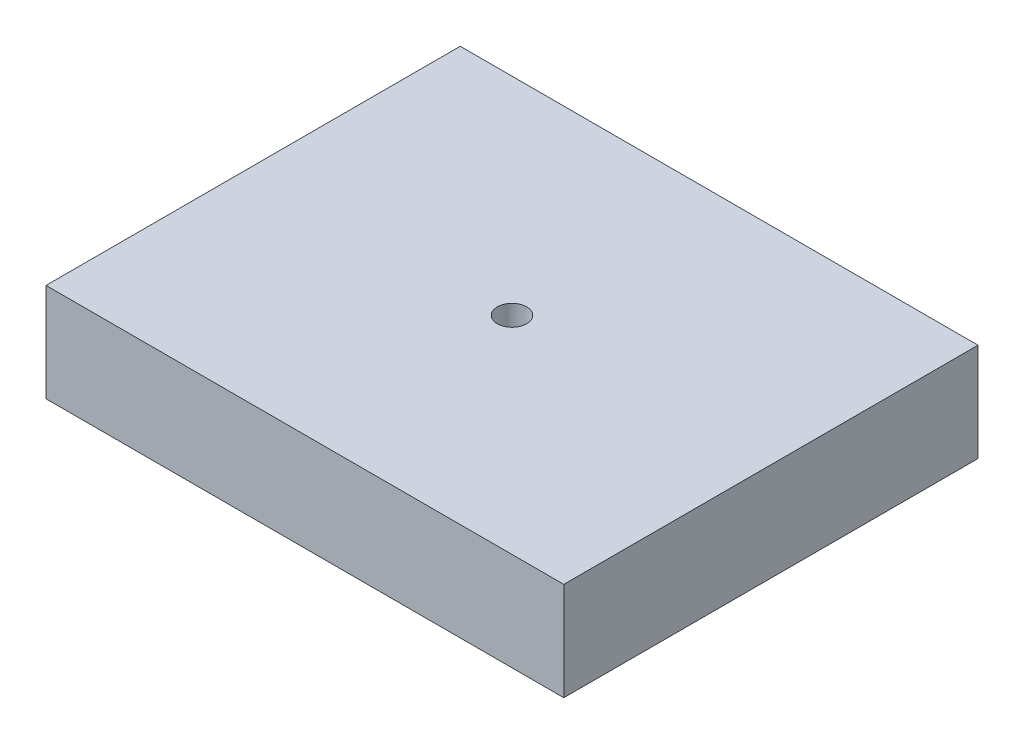
ISO-10303-21;
HEADER;
FILE_DESCRIPTION(('STEP AP214'),'2;1');
FILE_NAME('part.step','',(''),(''),'','','');
FILE_SCHEMA(('AUTOMOTIVE_DESIGN { 1 0 10303 214 1 1 1 1 }'));
ENDSEC;
DATA;
#1=APPLICATION_CONTEXT('core data for automotive mechanical design processes');
#2=APPLICATION_PROTOCOL_DEFINITION('international standard','automotive_design',2000,#1);
#3=PRODUCT_CONTEXT('',#1,'mechanical');
#4=PRODUCT('Part','Part','',(#3));
#5=PRODUCT_RELATED_PRODUCT_CATEGORY('part','',(#4));
#6=PRODUCT_DEFINITION_FORMATION('','',#4);
#7=PRODUCT_DEFINITION_CONTEXT('part definition',#1,'design');
#8=PRODUCT_DEFINITION('design','',#6,#7);
#9=PRODUCT_DEFINITION_SHAPE('','',#8);
#10=(LENGTH_UNIT() NAMED_UNIT(*) SI_UNIT(.MILLI.,.METRE.));
#11=(NAMED_UNIT(*) PLANE_ANGLE_UNIT() SI_UNIT($,.RADIAN.));
#12=(NAMED_UNIT(*) SI_UNIT($,.STERADIAN.) SOLID_ANGLE_UNIT());
#13=UNCERTAINTY_MEASURE_WITH_UNIT(LENGTH_MEASURE(1.E-05),#10,'distance_accuracy_value','');
#14=(GEOMETRIC_REPRESENTATION_CONTEXT(3) GLOBAL_UNCERTAINTY_ASSIGNED_CONTEXT((#13)) GLOBAL_UNIT_ASSIGNED_CONTEXT((#10,
#11,#12)) REPRESENTATION_CONTEXT('',''));
#15=CARTESIAN_POINT('',(0.,0.,0.));
#16=DIRECTION('',(0.,0.,1.));
#17=DIRECTION('',(1.,0.,0.));
#18=AXIS2_PLACEMENT_3D('',#15,#16,#17);
#19=CARTESIAN_POINT('',(33.4831224032625,12.7,26.78649792261));
#20=DIRECTION('',(-1.,0.,0.));
#21=DIRECTION('',(0.,0.,1.));
#22=AXIS2_PLACEMENT_3D('',#19,#20,#21);
#23=PLANE('',#22);
#24=DIRECTION('',(0.,0.,-1.));
#25=VECTOR('',#24,1.);
#26=CARTESIAN_POINT('',(33.4831224032625,0.,26.78649792261));
#27=LINE('',#26,#25);
#28=CARTESIAN_POINT('',(33.4831224032625,0.,26.78649792261));
#29=VERTEX_POINT('',#28);
#30=CARTESIAN_POINT('',(33.4831224032625,0.,-26.78649792261));
#31=VERTEX_POINT('',#30);
#32=EDGE_CURVE('E100',#29,#31,#27,.T.);
#33=ORIENTED_EDGE('',*,*,#32,.T.);
#34=DIRECTION('',(0.,-1.,0.));
#35=VECTOR('',#34,1.);
#36=CARTESIAN_POINT('',(33.4831224032625,12.7,-26.78649792261));
#37=LINE('',#36,#35);
#38=CARTESIAN_POINT('',(33.4831224032625,12.7,-26.78649792261));
#39=VERTEX_POINT('',#38);
#40=EDGE_CURVE('E11',#39,#31,#37,.T.);
#41=ORIENTED_EDGE('',*,*,#40,.F.);
#42=DIRECTION('',(0.,0.,-1.));
#43=VECTOR('',#42,1.);
#44=CARTESIAN_POINT('',(33.4831224032625,12.7,26.78649792261));
#45=LINE('',#44,#43);
#46=CARTESIAN_POINT('',(33.4831224032625,12.7,26.78649792261));
#47=VERTEX_POINT('',#46);
#48=EDGE_CURVE('E88',#47,#39,#45,.T.);
#49=ORIENTED_EDGE('',*,*,#48,.F.);
#50=DIRECTION('',(0.,-1.,0.));
#51=VECTOR('',#50,1.);
#52=CARTESIAN_POINT('',(33.4831224032625,12.7,26.78649792261));
#53=LINE('',#52,#51);
#54=EDGE_CURVE('E96',#47,#29,#53,.T.);
#55=ORIENTED_EDGE('',*,*,#54,.T.);
#56=EDGE_LOOP('',(#33,#41,#49,#55));
#57=FACE_BOUND('',#56,.T.);
#58=ADVANCED_FACE('F37',(#57),#23,.F.);
#59=CARTESIAN_POINT('',(-33.4831224032625,12.7,-26.78649792261));
#60=DIRECTION('',(0.,0.,1.));
#61=DIRECTION('',(1.,0.,0.));
#62=AXIS2_PLACEMENT_3D('',#59,#60,#61);
#63=PLANE('',#62);
#64=DIRECTION('',(-1.,0.,0.));
#65=VECTOR('',#64,1.);
#66=CARTESIAN_POINT('',(-33.4831224032625,0.,-26.78649792261));
#67=LINE('',#66,#65);
#68=CARTESIAN_POINT('',(-33.4831224032625,0.,-26.78649792261));
#69=VERTEX_POINT('',#68);
#70=EDGE_CURVE('E92',#31,#69,#67,.T.);
#71=ORIENTED_EDGE('',*,*,#70,.T.);
#72=DIRECTION('',(0.,-1.,0.));
#73=VECTOR('',#72,1.);
#74=CARTESIAN_POINT('',(-33.4831224032625,12.7,-26.78649792261));
#75=LINE('',#74,#73);
#76=CARTESIAN_POINT('',(-33.4831224032625,12.7,-26.78649792261));
#77=VERTEX_POINT('',#76);
#78=EDGE_CURVE('E45',#77,#69,#75,.T.);
#79=ORIENTED_EDGE('',*,*,#78,.F.);
#80=DIRECTION('',(-1.,0.,0.));
#81=VECTOR('',#80,1.);
#82=CARTESIAN_POINT('',(-33.4831224032625,12.7,-26.78649792261));
#83=LINE('',#82,#81);
#84=EDGE_CURVE('E83',#39,#77,#83,.T.);
#85=ORIENTED_EDGE('',*,*,#84,.F.);
#86=ORIENTED_EDGE('',*,*,#40,.T.);
#87=EDGE_LOOP('',(#71,#79,#85,#86));
#88=FACE_BOUND('',#87,.T.);
#89=ADVANCED_FACE('F91',(#88),#63,.F.);
#90=CARTESIAN_POINT('',(-33.4831224032625,12.7,26.78649792261));
#91=DIRECTION('',(1.,0.,0.));
#92=DIRECTION('',(0.,0.,-1.));
#93=AXIS2_PLACEMENT_3D('',#90,#91,#92);
#94=PLANE('',#93);
#95=DIRECTION('',(0.,0.,1.));
#96=VECTOR('',#95,1.);
#97=CARTESIAN_POINT('',(-33.4831224032625,0.,26.78649792261));
#98=LINE('',#97,#96);
#99=CARTESIAN_POINT('',(-33.4831224032625,0.,26.78649792261));
#100=VERTEX_POINT('',#99);
#101=EDGE_CURVE('E70',#69,#100,#98,.T.);
#102=ORIENTED_EDGE('',*,*,#101,.T.);
#103=DIRECTION('',(0.,-1.,0.));
#104=VECTOR('',#103,1.);
#105=CARTESIAN_POINT('',(-33.4831224032625,12.7,26.78649792261));
#106=LINE('',#105,#104);
#107=CARTESIAN_POINT('',(-33.4831224032625,12.7,26.78649792261));
#108=VERTEX_POINT('',#107);
#109=EDGE_CURVE('E93',#108,#100,#106,.T.);
#110=ORIENTED_EDGE('',*,*,#109,.F.);
#111=DIRECTION('',(0.,0.,1.));
#112=VECTOR('',#111,1.);
#113=CARTESIAN_POINT('',(-33.4831224032625,12.7,26.78649792261));
#114=LINE('',#113,#112);
#115=EDGE_CURVE('E86',#77,#108,#114,.T.);
#116=ORIENTED_EDGE('',*,*,#115,.F.);
#117=ORIENTED_EDGE('',*,*,#78,.T.);
#118=EDGE_LOOP('',(#102,#110,#116,#117));
#119=FACE_BOUND('',#118,.T.);
#120=ADVANCED_FACE('F94',(#119),#94,.F.);
#121=CARTESIAN_POINT('',(-33.4831224032625,12.7,26.78649792261));
#122=DIRECTION('',(0.,0.,-1.));
#123=DIRECTION('',(-1.,0.,0.));
#124=AXIS2_PLACEMENT_3D('',#121,#122,#123);
#125=PLANE('',#124);
#126=DIRECTION('',(1.,0.,0.));
#127=VECTOR('',#126,1.);
#128=CARTESIAN_POINT('',(-33.4831224032625,0.,26.78649792261));
#129=LINE('',#128,#127);
#130=EDGE_CURVE('E76',#100,#29,#129,.T.);
#131=ORIENTED_EDGE('',*,*,#130,.T.);
#132=ORIENTED_EDGE('',*,*,#54,.F.);
#133=DIRECTION('',(1.,0.,0.));
#134=VECTOR('',#133,1.);
#135=CARTESIAN_POINT('',(-33.4831224032625,12.7,26.78649792261));
#136=LINE('',#135,#134);
#137=EDGE_CURVE('E53',#108,#47,#136,.T.);
#138=ORIENTED_EDGE('',*,*,#137,.F.);
#139=ORIENTED_EDGE('',*,*,#109,.T.);
#140=EDGE_LOOP('',(#131,#132,#138,#139));
#141=FACE_BOUND('',#140,.T.);
#142=ADVANCED_FACE('F108',(#141),#125,.F.);
#143=CARTESIAN_POINT('',(0.,12.7,0.));
#144=DIRECTION('',(0.,-1.,0.));
#145=DIRECTION('',(0.,0.,-1.));
#146=AXIS2_PLACEMENT_3D('',#143,#144,#145);
#147=PLANE('',#146);
#148=CARTESIAN_POINT('',(0.,12.7,0.));
#149=DIRECTION('',(0.,1.,0.));
#150=DIRECTION('',(0.,0.,1.));
#151=AXIS2_PLACEMENT_3D('',#148,#149,#150);
#152=CIRCLE('',#151,1.89865);
#153=CARTESIAN_POINT('',(0.,12.7,1.89865));
#154=VERTEX_POINT('',#153);
#155=EDGE_CURVE('E116',#154,#154,#152,.T.);
#156=ORIENTED_EDGE('',*,*,#155,.F.);
#157=EDGE_LOOP('',(#156));
#158=FACE_BOUND('',#157,.T.);
#159=ORIENTED_EDGE('',*,*,#48,.T.);
#160=ORIENTED_EDGE('',*,*,#84,.T.);
#161=ORIENTED_EDGE('',*,*,#115,.T.);
#162=ORIENTED_EDGE('',*,*,#137,.T.);
#163=EDGE_LOOP('',(#159,#160,#161,#162));
#164=FACE_BOUND('',#163,.T.);
#165=ADVANCED_FACE('F84',(#158,#164),#147,.F.);
#166=CARTESIAN_POINT('',(0.,0.,0.));
#167=DIRECTION('',(0.,-1.,0.));
#168=DIRECTION('',(0.,0.,-1.));
#169=AXIS2_PLACEMENT_3D('',#166,#167,#168);
#170=PLANE('',#169);
#171=CARTESIAN_POINT('',(0.,0.,0.));
#172=DIRECTION('',(0.,1.,0.));
#173=DIRECTION('',(0.,0.,1.));
#174=AXIS2_PLACEMENT_3D('',#171,#172,#173);
#175=CIRCLE('',#174,1.89865);
#176=CARTESIAN_POINT('',(0.,0.,1.89865));
#177=VERTEX_POINT('',#176);
#178=EDGE_CURVE('E103',#177,#177,#175,.T.);
#179=ORIENTED_EDGE('',*,*,#178,.T.);
#180=EDGE_LOOP('',(#179));
#181=FACE_BOUND('',#180,.T.);
#182=ORIENTED_EDGE('',*,*,#32,.F.);
#183=ORIENTED_EDGE('',*,*,#130,.F.);
#184=ORIENTED_EDGE('',*,*,#101,.F.);
#185=ORIENTED_EDGE('',*,*,#70,.F.);
#186=EDGE_LOOP('',(#182,#183,#184,#185));
#187=FACE_BOUND('',#186,.T.);
#188=ADVANCED_FACE('F111',(#181,#187),#170,.T.);
#189=CARTESIAN_POINT('',(0.,12.7,0.));
#190=DIRECTION('',(0.,1.,0.));
#191=DIRECTION('',(0.,0.,1.));
#192=AXIS2_PLACEMENT_3D('',#189,#190,#191);
#193=CYLINDRICAL_SURFACE('',#192,1.89865);
#194=ORIENTED_EDGE('',*,*,#178,.F.);
#195=EDGE_LOOP('',(#194));
#196=FACE_BOUND('',#195,.T.);
#197=ORIENTED_EDGE('',*,*,#155,.T.);
#198=EDGE_LOOP('',(#197));
#199=FACE_BOUND('',#198,.T.);
#200=ADVANCED_FACE('F120',(#196,#199),#193,.F.);
#201=CLOSED_SHELL('',(#58,#89,#120,#142,#165,#188,#200));
#202=MANIFOLD_SOLID_BREP('B2',#201);
#203=ADVANCED_BREP_SHAPE_REPRESENTATION('',(#18,#202),#14);
#204=SHAPE_DEFINITION_REPRESENTATION(#9,#203);
ENDSEC;
END-ISO-10303-21;
